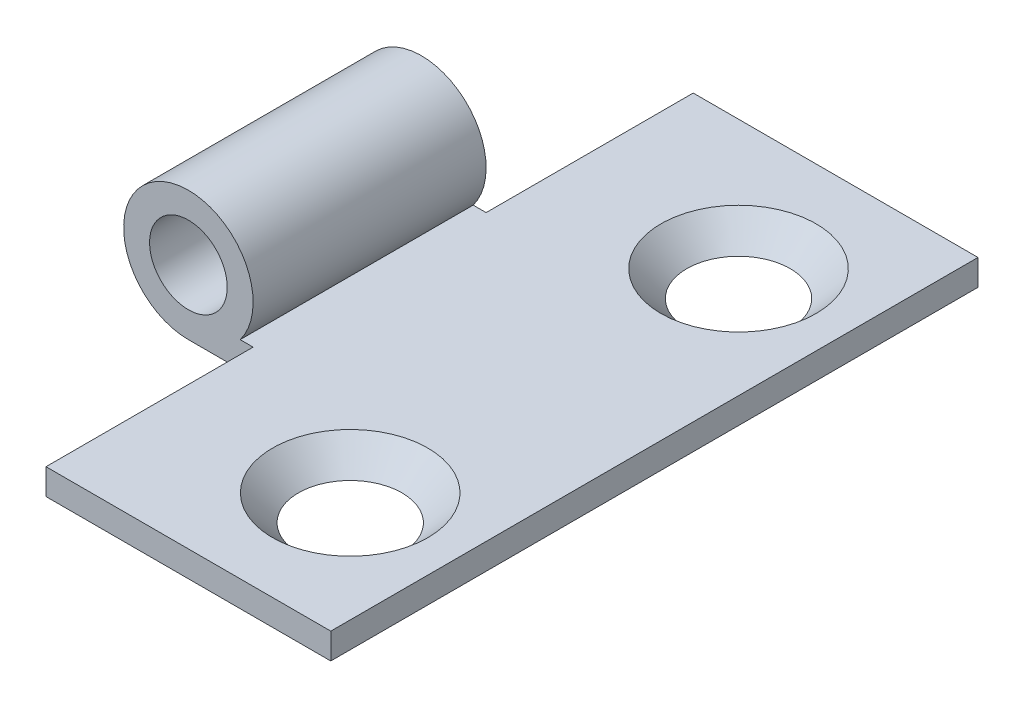
ISO-10303-21;
HEADER;
FILE_DESCRIPTION(('STEP AP214'),'2;1');
FILE_NAME('part.step','',(''),(''),'','','');
FILE_SCHEMA(('AUTOMOTIVE_DESIGN { 1 0 10303 214 1 1 1 1 }'));
ENDSEC;
DATA;
#1=APPLICATION_CONTEXT('core data for automotive mechanical design processes');
#2=APPLICATION_PROTOCOL_DEFINITION('international standard','automotive_design',2000,#1);
#3=PRODUCT_CONTEXT('',#1,'mechanical');
#4=PRODUCT('Part','Part','',(#3));
#5=PRODUCT_RELATED_PRODUCT_CATEGORY('part','',(#4));
#6=PRODUCT_DEFINITION_FORMATION('','',#4);
#7=PRODUCT_DEFINITION_CONTEXT('part definition',#1,'design');
#8=PRODUCT_DEFINITION('design','',#6,#7);
#9=PRODUCT_DEFINITION_SHAPE('','',#8);
#10=(LENGTH_UNIT() NAMED_UNIT(*) SI_UNIT(.MILLI.,.METRE.));
#11=(NAMED_UNIT(*) PLANE_ANGLE_UNIT() SI_UNIT($,.RADIAN.));
#12=(NAMED_UNIT(*) SI_UNIT($,.STERADIAN.) SOLID_ANGLE_UNIT());
#13=UNCERTAINTY_MEASURE_WITH_UNIT(LENGTH_MEASURE(1.E-05),#10,'distance_accuracy_value','');
#14=(GEOMETRIC_REPRESENTATION_CONTEXT(3) GLOBAL_UNCERTAINTY_ASSIGNED_CONTEXT((#13)) GLOBAL_UNIT_ASSIGNED_CONTEXT((#10,
#11,#12)) REPRESENTATION_CONTEXT('',''));
#15=CARTESIAN_POINT('',(0.,0.,0.));
#16=DIRECTION('',(0.,0.,1.));
#17=DIRECTION('',(1.,0.,0.));
#18=AXIS2_PLACEMENT_3D('',#15,#16,#17);
#19=CARTESIAN_POINT('',(0.,0.,25.));
#20=DIRECTION('',(0.,0.,-1.));
#21=DIRECTION('',(-1.,0.,0.));
#22=AXIS2_PLACEMENT_3D('',#19,#20,#21);
#23=CYLINDRICAL_SURFACE('',#22,2.5);
#24=DIRECTION('',(0.,0.,-1.));
#25=VECTOR('',#24,1.);
#26=CARTESIAN_POINT('',(2.,-1.5,25.));
#27=LINE('',#26,#25);
#28=CARTESIAN_POINT('',(2.,-1.5,17.));
#29=VERTEX_POINT('',#28);
#30=CARTESIAN_POINT('',(2.,-1.5,8.));
#31=VERTEX_POINT('',#30);
#32=EDGE_CURVE('E149',#29,#31,#27,.T.);
#33=ORIENTED_EDGE('',*,*,#32,.T.);
#34=CARTESIAN_POINT('',(0.,0.,8.));
#35=DIRECTION('',(0.,0.,1.));
#36=DIRECTION('',(1.,0.,0.));
#37=AXIS2_PLACEMENT_3D('',#34,#35,#36);
#38=CIRCLE('',#37,2.5);
#39=CARTESIAN_POINT('',(0.,-2.5,8.));
#40=VERTEX_POINT('',#39);
#41=EDGE_CURVE('E134',#31,#40,#38,.T.);
#42=ORIENTED_EDGE('',*,*,#41,.T.);
#43=DIRECTION('',(0.,0.,-1.));
#44=VECTOR('',#43,1.);
#45=CARTESIAN_POINT('',(0.,-2.5,25.));
#46=LINE('',#45,#44);
#47=CARTESIAN_POINT('',(0.,-2.5,17.));
#48=VERTEX_POINT('',#47);
#49=EDGE_CURVE('E160',#48,#40,#46,.T.);
#50=ORIENTED_EDGE('',*,*,#49,.F.);
#51=CARTESIAN_POINT('',(0.,0.,17.));
#52=DIRECTION('',(0.,0.,-1.));
#53=DIRECTION('',(-1.,0.,0.));
#54=AXIS2_PLACEMENT_3D('',#51,#52,#53);
#55=CIRCLE('',#54,2.5);
#56=EDGE_CURVE('E174',#48,#29,#55,.T.);
#57=ORIENTED_EDGE('',*,*,#56,.T.);
#58=EDGE_LOOP('',(#33,#42,#50,#57));
#59=FACE_BOUND('',#58,.T.);
#60=ADVANCED_FACE('F41',(#59),#23,.T.);
#61=CARTESIAN_POINT('',(0.,0.,25.));
#62=DIRECTION('',(0.,0.,1.));
#63=DIRECTION('',(1.,0.,0.));
#64=AXIS2_PLACEMENT_3D('',#61,#62,#63);
#65=PLANE('',#64);
#66=DIRECTION('',(0.,-1.,0.));
#67=VECTOR('',#66,1.);
#68=CARTESIAN_POINT('',(2.5,2.5,25.));
#69=LINE('',#68,#67);
#70=CARTESIAN_POINT('',(2.5,-1.5,25.));
#71=VERTEX_POINT('',#70);
#72=CARTESIAN_POINT('',(2.5,-2.5,25.));
#73=VERTEX_POINT('',#72);
#74=EDGE_CURVE('E169',#71,#73,#69,.T.);
#75=ORIENTED_EDGE('',*,*,#74,.T.);
#76=DIRECTION('',(1.,0.,0.));
#77=VECTOR('',#76,1.);
#78=CARTESIAN_POINT('',(0.,-2.5,25.));
#79=LINE('',#78,#77);
#80=CARTESIAN_POINT('',(13.5,-2.5,25.));
#81=VERTEX_POINT('',#80);
#82=EDGE_CURVE('E148',#73,#81,#79,.T.);
#83=ORIENTED_EDGE('',*,*,#82,.T.);
#84=DIRECTION('',(0.,1.,0.));
#85=VECTOR('',#84,1.);
#86=CARTESIAN_POINT('',(13.5,-2.5,25.));
#87=LINE('',#86,#85);
#88=CARTESIAN_POINT('',(13.5,-1.5,25.));
#89=VERTEX_POINT('',#88);
#90=EDGE_CURVE('E257',#81,#89,#87,.T.);
#91=ORIENTED_EDGE('',*,*,#90,.T.);
#92=DIRECTION('',(-1.,0.,0.));
#93=VECTOR('',#92,1.);
#94=CARTESIAN_POINT('',(13.5,-1.5,25.));
#95=LINE('',#94,#93);
#96=EDGE_CURVE('E143',#89,#71,#95,.T.);
#97=ORIENTED_EDGE('',*,*,#96,.T.);
#98=EDGE_LOOP('',(#75,#83,#91,#97));
#99=FACE_BOUND('',#98,.T.);
#100=ADVANCED_FACE('F196',(#99),#65,.T.);
#101=CARTESIAN_POINT('',(0.,0.,0.));
#102=DIRECTION('',(0.,0.,1.));
#103=DIRECTION('',(1.,0.,0.));
#104=AXIS2_PLACEMENT_3D('',#101,#102,#103);
#105=PLANE('',#104);
#106=DIRECTION('',(1.,0.,0.));
#107=VECTOR('',#106,1.);
#108=CARTESIAN_POINT('',(0.,-2.5,0.));
#109=LINE('',#108,#107);
#110=CARTESIAN_POINT('',(2.5,-2.5,0.));
#111=VERTEX_POINT('',#110);
#112=CARTESIAN_POINT('',(13.5,-2.5,0.));
#113=VERTEX_POINT('',#112);
#114=EDGE_CURVE('E125',#111,#113,#109,.T.);
#115=ORIENTED_EDGE('',*,*,#114,.F.);
#116=DIRECTION('',(0.,-1.,0.));
#117=VECTOR('',#116,1.);
#118=CARTESIAN_POINT('',(2.5,2.5,0.));
#119=LINE('',#118,#117);
#120=CARTESIAN_POINT('',(2.5,-1.5,0.));
#121=VERTEX_POINT('',#120);
#122=EDGE_CURVE('E107',#121,#111,#119,.T.);
#123=ORIENTED_EDGE('',*,*,#122,.F.);
#124=DIRECTION('',(-1.,0.,0.));
#125=VECTOR('',#124,1.);
#126=CARTESIAN_POINT('',(13.5,-1.5,0.));
#127=LINE('',#126,#125);
#128=CARTESIAN_POINT('',(13.5,-1.5,0.));
#129=VERTEX_POINT('',#128);
#130=EDGE_CURVE('E138',#129,#121,#127,.T.);
#131=ORIENTED_EDGE('',*,*,#130,.F.);
#132=DIRECTION('',(0.,1.,0.));
#133=VECTOR('',#132,1.);
#134=CARTESIAN_POINT('',(13.5,-2.5,0.));
#135=LINE('',#134,#133);
#136=EDGE_CURVE('E132',#113,#129,#135,.T.);
#137=ORIENTED_EDGE('',*,*,#136,.F.);
#138=EDGE_LOOP('',(#115,#123,#131,#137));
#139=FACE_BOUND('',#138,.T.);
#140=ADVANCED_FACE('F131',(#139),#105,.F.);
#141=CARTESIAN_POINT('',(0.,-2.5,25.));
#142=DIRECTION('',(0.,1.,0.));
#143=DIRECTION('',(0.,0.,1.));
#144=AXIS2_PLACEMENT_3D('',#141,#142,#143);
#145=PLANE('',#144);
#146=CARTESIAN_POINT('',(9.25,-2.5,5.));
#147=DIRECTION('',(0.,-1.,0.));
#148=DIRECTION('',(0.,0.,1.));
#149=AXIS2_PLACEMENT_3D('',#146,#147,#148);
#150=CIRCLE('',#149,2.);
#151=CARTESIAN_POINT('',(9.25,-2.5,7.));
#152=VERTEX_POINT('',#151);
#153=EDGE_CURVE('E279',#152,#152,#150,.T.);
#154=ORIENTED_EDGE('',*,*,#153,.F.);
#155=EDGE_LOOP('',(#154));
#156=FACE_BOUND('',#155,.T.);
#157=CARTESIAN_POINT('',(9.25,-2.5,20.));
#158=DIRECTION('',(0.,-1.,0.));
#159=DIRECTION('',(0.,0.,-1.));
#160=AXIS2_PLACEMENT_3D('',#157,#158,#159);
#161=CIRCLE('',#160,2.);
#162=CARTESIAN_POINT('',(9.25,-2.5,18.));
#163=VERTEX_POINT('',#162);
#164=EDGE_CURVE('E275',#163,#163,#161,.T.);
#165=ORIENTED_EDGE('',*,*,#164,.F.);
#166=EDGE_LOOP('',(#165));
#167=FACE_BOUND('',#166,.T.);
#168=ORIENTED_EDGE('',*,*,#49,.T.);
#169=DIRECTION('',(-1.,0.,0.));
#170=VECTOR('',#169,1.);
#171=CARTESIAN_POINT('',(-2.5,-2.5,8.));
#172=LINE('',#171,#170);
#173=CARTESIAN_POINT('',(2.5,-2.5,8.));
#174=VERTEX_POINT('',#173);
#175=EDGE_CURVE('E119',#174,#40,#172,.T.);
#176=ORIENTED_EDGE('',*,*,#175,.F.);
#177=DIRECTION('',(0.,0.,1.));
#178=VECTOR('',#177,1.);
#179=CARTESIAN_POINT('',(2.5,-2.5,0.));
#180=LINE('',#179,#178);
#181=EDGE_CURVE('E110',#111,#174,#180,.T.);
#182=ORIENTED_EDGE('',*,*,#181,.F.);
#183=ORIENTED_EDGE('',*,*,#114,.T.);
#184=DIRECTION('',(0.,0.,-1.));
#185=VECTOR('',#184,1.);
#186=CARTESIAN_POINT('',(13.5,-2.5,25.));
#187=LINE('',#186,#185);
#188=EDGE_CURVE('E157',#81,#113,#187,.T.);
#189=ORIENTED_EDGE('',*,*,#188,.F.);
#190=ORIENTED_EDGE('',*,*,#82,.F.);
#191=DIRECTION('',(0.,0.,1.));
#192=VECTOR('',#191,1.);
#193=CARTESIAN_POINT('',(2.5,-2.5,25.));
#194=LINE('',#193,#192);
#195=CARTESIAN_POINT('',(2.5,-2.5,17.));
#196=VERTEX_POINT('',#195);
#197=EDGE_CURVE('E267',#196,#73,#194,.T.);
#198=ORIENTED_EDGE('',*,*,#197,.F.);
#199=DIRECTION('',(1.,0.,0.));
#200=VECTOR('',#199,1.);
#201=CARTESIAN_POINT('',(-2.5,-2.5,17.));
#202=LINE('',#201,#200);
#203=EDGE_CURVE('E273',#48,#196,#202,.T.);
#204=ORIENTED_EDGE('',*,*,#203,.F.);
#205=EDGE_LOOP('',(#168,#176,#182,#183,#189,#190,#198,#204));
#206=FACE_BOUND('',#205,.T.);
#207=ADVANCED_FACE('F123',(#156,#167,#206),#145,.F.);
#208=CARTESIAN_POINT('',(13.5,-2.5,25.));
#209=DIRECTION('',(-1.,0.,0.));
#210=DIRECTION('',(0.,0.,1.));
#211=AXIS2_PLACEMENT_3D('',#208,#209,#210);
#212=PLANE('',#211);
#213=ORIENTED_EDGE('',*,*,#136,.T.);
#214=DIRECTION('',(0.,0.,-1.));
#215=VECTOR('',#214,1.);
#216=CARTESIAN_POINT('',(13.5,-1.5,25.));
#217=LINE('',#216,#215);
#218=EDGE_CURVE('E153',#89,#129,#217,.T.);
#219=ORIENTED_EDGE('',*,*,#218,.F.);
#220=ORIENTED_EDGE('',*,*,#90,.F.);
#221=ORIENTED_EDGE('',*,*,#188,.T.);
#222=EDGE_LOOP('',(#213,#219,#220,#221));
#223=FACE_BOUND('',#222,.T.);
#224=ADVANCED_FACE('F212',(#223),#212,.F.);
#225=CARTESIAN_POINT('',(13.5,-1.5,25.));
#226=DIRECTION('',(0.,-1.,0.));
#227=DIRECTION('',(1.,0.,0.));
#228=AXIS2_PLACEMENT_3D('',#225,#226,#227);
#229=PLANE('',#228);
#230=CARTESIAN_POINT('',(9.25,-1.5,20.));
#231=DIRECTION('',(0.,-1.,0.));
#232=DIRECTION('',(1.,0.,0.));
#233=AXIS2_PLACEMENT_3D('',#230,#231,#232);
#234=CIRCLE('',#233,3.);
#235=CARTESIAN_POINT('',(12.25,-1.5,20.));
#236=VERTEX_POINT('',#235);
#237=EDGE_CURVE('E11',#236,#236,#234,.T.);
#238=ORIENTED_EDGE('',*,*,#237,.T.);
#239=EDGE_LOOP('',(#238));
#240=FACE_BOUND('',#239,.T.);
#241=CARTESIAN_POINT('',(9.25,-1.5,5.));
#242=DIRECTION('',(0.,-1.,0.));
#243=DIRECTION('',(1.,0.,0.));
#244=AXIS2_PLACEMENT_3D('',#241,#242,#243);
#245=CIRCLE('',#244,3.);
#246=CARTESIAN_POINT('',(12.25,-1.5,5.));
#247=VERTEX_POINT('',#246);
#248=EDGE_CURVE('E51',#247,#247,#245,.T.);
#249=ORIENTED_EDGE('',*,*,#248,.T.);
#250=EDGE_LOOP('',(#249));
#251=FACE_BOUND('',#250,.T.);
#252=DIRECTION('',(0.,0.,1.));
#253=VECTOR('',#252,1.);
#254=CARTESIAN_POINT('',(2.5,-1.5,25.));
#255=LINE('',#254,#253);
#256=CARTESIAN_POINT('',(2.5,-1.5,8.));
#257=VERTEX_POINT('',#256);
#258=EDGE_CURVE('E113',#121,#257,#255,.T.);
#259=ORIENTED_EDGE('',*,*,#258,.T.);
#260=DIRECTION('',(-1.,0.,0.));
#261=VECTOR('',#260,1.);
#262=CARTESIAN_POINT('',(13.5,-1.5,8.));
#263=LINE('',#262,#261);
#264=EDGE_CURVE('E140',#257,#31,#263,.T.);
#265=ORIENTED_EDGE('',*,*,#264,.T.);
#266=ORIENTED_EDGE('',*,*,#32,.F.);
#267=DIRECTION('',(1.,0.,0.));
#268=VECTOR('',#267,1.);
#269=CARTESIAN_POINT('',(13.5,-1.5,17.));
#270=LINE('',#269,#268);
#271=CARTESIAN_POINT('',(2.5,-1.5,17.));
#272=VERTEX_POINT('',#271);
#273=EDGE_CURVE('E168',#29,#272,#270,.T.);
#274=ORIENTED_EDGE('',*,*,#273,.T.);
#275=DIRECTION('',(0.,0.,1.));
#276=VECTOR('',#275,1.);
#277=CARTESIAN_POINT('',(2.5,-1.5,25.));
#278=LINE('',#277,#276);
#279=EDGE_CURVE('E163',#272,#71,#278,.T.);
#280=ORIENTED_EDGE('',*,*,#279,.T.);
#281=ORIENTED_EDGE('',*,*,#96,.F.);
#282=ORIENTED_EDGE('',*,*,#218,.T.);
#283=ORIENTED_EDGE('',*,*,#130,.T.);
#284=EDGE_LOOP('',(#259,#265,#266,#274,#280,#281,#282,#283));
#285=FACE_BOUND('',#284,.T.);
#286=ADVANCED_FACE('F183',(#240,#251,#285),#229,.F.);
#287=CARTESIAN_POINT('',(2.5,2.5,25.));
#288=DIRECTION('',(1.,0.,0.));
#289=DIRECTION('',(0.,0.,-1.));
#290=AXIS2_PLACEMENT_3D('',#287,#288,#289);
#291=PLANE('',#290);
#292=DIRECTION('',(0.,-1.,0.));
#293=VECTOR('',#292,1.);
#294=CARTESIAN_POINT('',(2.5,2.5,17.));
#295=LINE('',#294,#293);
#296=EDGE_CURVE('E66',#272,#196,#295,.T.);
#297=ORIENTED_EDGE('',*,*,#296,.T.);
#298=ORIENTED_EDGE('',*,*,#197,.T.);
#299=ORIENTED_EDGE('',*,*,#74,.F.);
#300=ORIENTED_EDGE('',*,*,#279,.F.);
#301=EDGE_LOOP('',(#297,#298,#299,#300));
#302=FACE_BOUND('',#301,.T.);
#303=ADVANCED_FACE('F219',(#302),#291,.F.);
#304=CARTESIAN_POINT('',(-2.5,2.5,17.));
#305=DIRECTION('',(0.,0.,-1.));
#306=DIRECTION('',(-1.,0.,0.));
#307=AXIS2_PLACEMENT_3D('',#304,#305,#306);
#308=PLANE('',#307);
#309=CARTESIAN_POINT('',(0.,0.,17.));
#310=DIRECTION('',(0.,0.,-1.));
#311=DIRECTION('',(-1.,0.,0.));
#312=AXIS2_PLACEMENT_3D('',#309,#310,#311);
#313=CIRCLE('',#312,1.5);
#314=CARTESIAN_POINT('',(-1.5,0.,17.));
#315=VERTEX_POINT('',#314);
#316=EDGE_CURVE('E164',#315,#315,#313,.T.);
#317=ORIENTED_EDGE('',*,*,#316,.T.);
#318=EDGE_LOOP('',(#317));
#319=FACE_BOUND('',#318,.T.);
#320=ORIENTED_EDGE('',*,*,#203,.T.);
#321=ORIENTED_EDGE('',*,*,#296,.F.);
#322=ORIENTED_EDGE('',*,*,#273,.F.);
#323=ORIENTED_EDGE('',*,*,#56,.F.);
#324=EDGE_LOOP('',(#320,#321,#322,#323));
#325=FACE_BOUND('',#324,.T.);
#326=ADVANCED_FACE('F227',(#319,#325),#308,.F.);
#327=CARTESIAN_POINT('',(2.5,2.5,0.));
#328=DIRECTION('',(1.,0.,0.));
#329=DIRECTION('',(0.,0.,-1.));
#330=AXIS2_PLACEMENT_3D('',#327,#328,#329);
#331=PLANE('',#330);
#332=ORIENTED_EDGE('',*,*,#122,.T.);
#333=ORIENTED_EDGE('',*,*,#181,.T.);
#334=DIRECTION('',(0.,-1.,0.));
#335=VECTOR('',#334,1.);
#336=CARTESIAN_POINT('',(2.5,2.5,8.));
#337=LINE('',#336,#335);
#338=EDGE_CURVE('E58',#257,#174,#337,.T.);
#339=ORIENTED_EDGE('',*,*,#338,.F.);
#340=ORIENTED_EDGE('',*,*,#258,.F.);
#341=EDGE_LOOP('',(#332,#333,#339,#340));
#342=FACE_BOUND('',#341,.T.);
#343=ADVANCED_FACE('F109',(#342),#331,.F.);
#344=CARTESIAN_POINT('',(-2.5,2.5,8.));
#345=DIRECTION('',(0.,0.,1.));
#346=DIRECTION('',(1.,0.,0.));
#347=AXIS2_PLACEMENT_3D('',#344,#345,#346);
#348=PLANE('',#347);
#349=CARTESIAN_POINT('',(0.,0.,8.));
#350=DIRECTION('',(0.,0.,1.));
#351=DIRECTION('',(1.,0.,0.));
#352=AXIS2_PLACEMENT_3D('',#349,#350,#351);
#353=CIRCLE('',#352,1.5);
#354=CARTESIAN_POINT('',(1.5,0.,8.));
#355=VERTEX_POINT('',#354);
#356=EDGE_CURVE('E170',#355,#355,#353,.T.);
#357=ORIENTED_EDGE('',*,*,#356,.T.);
#358=EDGE_LOOP('',(#357));
#359=FACE_BOUND('',#358,.T.);
#360=ORIENTED_EDGE('',*,*,#41,.F.);
#361=ORIENTED_EDGE('',*,*,#264,.F.);
#362=ORIENTED_EDGE('',*,*,#338,.T.);
#363=ORIENTED_EDGE('',*,*,#175,.T.);
#364=EDGE_LOOP('',(#360,#361,#362,#363));
#365=FACE_BOUND('',#364,.T.);
#366=ADVANCED_FACE('F225',(#359,#365),#348,.F.);
#367=CARTESIAN_POINT('',(0.,0.,25.));
#368=DIRECTION('',(0.,0.,-1.));
#369=DIRECTION('',(-1.,0.,0.));
#370=AXIS2_PLACEMENT_3D('',#367,#368,#369);
#371=CYLINDRICAL_SURFACE('',#370,1.5);
#372=ORIENTED_EDGE('',*,*,#356,.F.);
#373=EDGE_LOOP('',(#372));
#374=FACE_BOUND('',#373,.T.);
#375=ORIENTED_EDGE('',*,*,#316,.F.);
#376=EDGE_LOOP('',(#375));
#377=FACE_BOUND('',#376,.T.);
#378=ADVANCED_FACE('F192',(#374,#377),#371,.F.);
#379=CARTESIAN_POINT('',(9.25,-1.5,20.));
#380=DIRECTION('',(0.,1.,0.));
#381=DIRECTION('',(0.,0.,1.));
#382=AXIS2_PLACEMENT_3D('',#379,#380,#381);
#383=CONICAL_SURFACE('',#382,3.,0.785398163397447);
#384=ORIENTED_EDGE('',*,*,#164,.T.);
#385=EDGE_LOOP('',(#384));
#386=FACE_BOUND('',#385,.T.);
#387=ORIENTED_EDGE('',*,*,#237,.F.);
#388=EDGE_LOOP('',(#387));
#389=FACE_BOUND('',#388,.T.);
#390=ADVANCED_FACE('F187',(#386,#389),#383,.F.);
#391=CARTESIAN_POINT('',(9.25,-1.5,5.));
#392=DIRECTION('',(0.,1.,0.));
#393=DIRECTION('',(0.,0.,1.));
#394=AXIS2_PLACEMENT_3D('',#391,#392,#393);
#395=CONICAL_SURFACE('',#394,3.,0.785398163397447);
#396=ORIENTED_EDGE('',*,*,#153,.T.);
#397=EDGE_LOOP('',(#396));
#398=FACE_BOUND('',#397,.T.);
#399=ORIENTED_EDGE('',*,*,#248,.F.);
#400=EDGE_LOOP('',(#399));
#401=FACE_BOUND('',#400,.T.);
#402=ADVANCED_FACE('F44',(#398,#401),#395,.F.);
#403=CLOSED_SHELL('',(#60,#100,#140,#207,#224,#286,#303,#326,#343,#366,#378,#390,#402));
#404=MANIFOLD_SOLID_BREP('B2',#403);
#405=ADVANCED_BREP_SHAPE_REPRESENTATION('',(#18,#404),#14);
#406=SHAPE_DEFINITION_REPRESENTATION(#9,#405);
ENDSEC;
END-ISO-10303-21;
